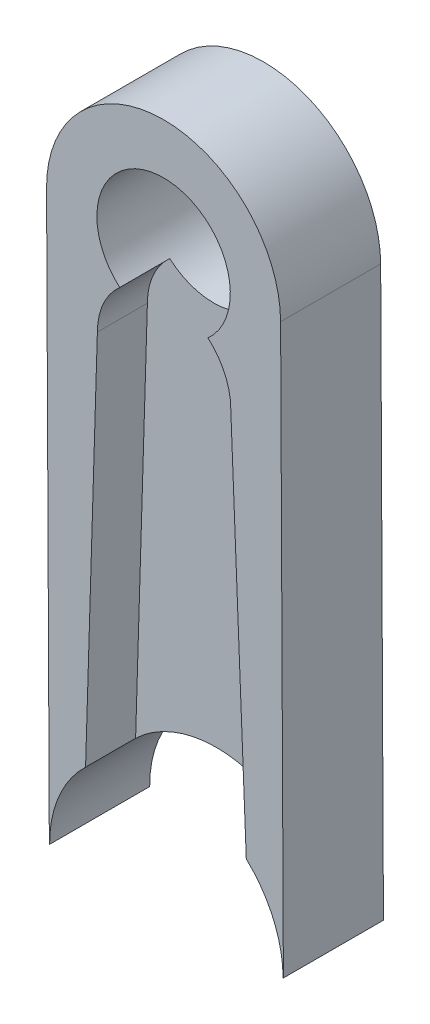
ISO-10303-21;
HEADER;
FILE_DESCRIPTION(('STEP AP214'),'2;1');
FILE_NAME('part.step','',(''),(''),'','','');
FILE_SCHEMA(('AUTOMOTIVE_DESIGN { 1 0 10303 214 1 1 1 1 }'));
ENDSEC;
DATA;
#1=APPLICATION_CONTEXT('core data for automotive mechanical design processes');
#2=APPLICATION_PROTOCOL_DEFINITION('international standard','automotive_design',2000,#1);
#3=PRODUCT_CONTEXT('',#1,'mechanical');
#4=PRODUCT('Part','Part','',(#3));
#5=PRODUCT_RELATED_PRODUCT_CATEGORY('part','',(#4));
#6=PRODUCT_DEFINITION_FORMATION('','',#4);
#7=PRODUCT_DEFINITION_CONTEXT('part definition',#1,'design');
#8=PRODUCT_DEFINITION('design','',#6,#7);
#9=PRODUCT_DEFINITION_SHAPE('','',#8);
#10=(LENGTH_UNIT() NAMED_UNIT(*) SI_UNIT(.MILLI.,.METRE.));
#11=(NAMED_UNIT(*) PLANE_ANGLE_UNIT() SI_UNIT($,.RADIAN.));
#12=(NAMED_UNIT(*) SI_UNIT($,.STERADIAN.) SOLID_ANGLE_UNIT());
#13=UNCERTAINTY_MEASURE_WITH_UNIT(LENGTH_MEASURE(1.E-05),#10,'distance_accuracy_value','');
#14=(GEOMETRIC_REPRESENTATION_CONTEXT(3) GLOBAL_UNCERTAINTY_ASSIGNED_CONTEXT((#13)) GLOBAL_UNIT_ASSIGNED_CONTEXT((#10,
#11,#12)) REPRESENTATION_CONTEXT('',''));
#15=CARTESIAN_POINT('',(0.,0.,0.));
#16=DIRECTION('',(0.,0.,1.));
#17=DIRECTION('',(1.,0.,0.));
#18=AXIS2_PLACEMENT_3D('',#15,#16,#17);
#19=CARTESIAN_POINT('',(-0.0685374686224018,14.,3.));
#20=DIRECTION('',(0.,0.,-1.));
#21=DIRECTION('',(-1.,0.,0.));
#22=AXIS2_PLACEMENT_3D('',#19,#20,#21);
#23=CYLINDRICAL_SURFACE('',#22,2.);
#24=CARTESIAN_POINT('',(-0.0685374686224018,14.,1.5));
#25=DIRECTION('',(0.,0.,1.));
#26=DIRECTION('',(1.,0.,0.));
#27=AXIS2_PLACEMENT_3D('',#24,#25,#26);
#28=CIRCLE('',#27,2.);
#29=CARTESIAN_POINT('',(-1.39872019117523,15.4935239953285,1.5));
#30=VERTEX_POINT('',#29);
#31=CARTESIAN_POINT('',(-2.0685374686224,14.,1.5));
#32=VERTEX_POINT('',#31);
#33=EDGE_CURVE('E49',#30,#32,#28,.T.);
#34=ORIENTED_EDGE('',*,*,#33,.F.);
#35=DIRECTION('',(0.,0.,-1.));
#36=VECTOR('',#35,1.);
#37=CARTESIAN_POINT('',(-1.39872019117523,15.4935239953285,3.));
#38=LINE('',#37,#36);
#39=CARTESIAN_POINT('',(-1.39872019117523,15.4935239953285,3.));
#40=VERTEX_POINT('',#39);
#41=EDGE_CURVE('E11',#40,#30,#38,.T.);
#42=ORIENTED_EDGE('',*,*,#41,.F.);
#43=CARTESIAN_POINT('',(-0.0685374686224018,14.,3.));
#44=DIRECTION('',(0.,0.,1.));
#45=DIRECTION('',(1.,0.,0.));
#46=AXIS2_PLACEMENT_3D('',#43,#44,#45);
#47=CIRCLE('',#46,2.);
#48=CARTESIAN_POINT('',(-2.0685374686224,14.,3.));
#49=VERTEX_POINT('',#48);
#50=EDGE_CURVE('E121',#40,#49,#47,.T.);
#51=ORIENTED_EDGE('',*,*,#50,.T.);
#52=DIRECTION('',(0.,0.,-1.));
#53=VECTOR('',#52,1.);
#54=CARTESIAN_POINT('',(-2.0685374686224,14.,3.));
#55=LINE('',#54,#53);
#56=EDGE_CURVE('E163',#49,#32,#55,.T.);
#57=ORIENTED_EDGE('',*,*,#56,.T.);
#58=EDGE_LOOP('',(#34,#42,#51,#57));
#59=FACE_BOUND('',#58,.T.);
#60=ADVANCED_FACE('F35',(#59),#23,.F.);
#61=CARTESIAN_POINT('',(-0.083224069041489,17.,3.));
#62=DIRECTION('',(0.,0.,-1.));
#63=DIRECTION('',(-1.,0.,0.));
#64=AXIS2_PLACEMENT_3D('',#61,#62,#63);
#65=CYLINDRICAL_SURFACE('',#64,2.);
#66=CARTESIAN_POINT('',(-0.083224069041489,17.,0.));
#67=DIRECTION('',(0.,0.,1.));
#68=DIRECTION('',(1.,0.,0.));
#69=AXIS2_PLACEMENT_3D('',#66,#67,#68);
#70=CIRCLE('',#69,2.);
#71=CARTESIAN_POINT('',(1.91677593095851,17.,0.));
#72=VERTEX_POINT('',#71);
#73=EDGE_CURVE('E164',#72,#72,#70,.T.);
#74=ORIENTED_EDGE('',*,*,#73,.F.);
#75=EDGE_LOOP('',(#74));
#76=FACE_BOUND('',#75,.T.);
#77=ORIENTED_EDGE('',*,*,#41,.T.);
#78=CARTESIAN_POINT('',(-0.083224069041489,17.,1.5));
#79=DIRECTION('',(0.,0.,1.));
#80=DIRECTION('',(1.,0.,0.));
#81=AXIS2_PLACEMENT_3D('',#78,#79,#80);
#82=CIRCLE('',#81,2.);
#83=CARTESIAN_POINT('',(1.24695865351134,15.5064760046715,1.5));
#84=VERTEX_POINT('',#83);
#85=EDGE_CURVE('E223',#30,#84,#82,.T.);
#86=ORIENTED_EDGE('',*,*,#85,.T.);
#87=DIRECTION('',(0.,0.,-1.));
#88=VECTOR('',#87,1.);
#89=CARTESIAN_POINT('',(1.24695865351134,15.5064760046715,3.));
#90=LINE('',#89,#88);
#91=CARTESIAN_POINT('',(1.24695865351134,15.5064760046715,3.));
#92=VERTEX_POINT('',#91);
#93=EDGE_CURVE('E42',#92,#84,#90,.T.);
#94=ORIENTED_EDGE('',*,*,#93,.F.);
#95=CARTESIAN_POINT('',(-0.083224069041489,17.,3.));
#96=DIRECTION('',(0.,0.,1.));
#97=DIRECTION('',(1.,0.,0.));
#98=AXIS2_PLACEMENT_3D('',#95,#96,#97);
#99=CIRCLE('',#98,2.);
#100=EDGE_CURVE('E130',#92,#40,#99,.T.);
#101=ORIENTED_EDGE('',*,*,#100,.T.);
#102=EDGE_LOOP('',(#77,#86,#94,#101));
#103=FACE_BOUND('',#102,.T.);
#104=ADVANCED_FACE('F137',(#76,#103),#65,.F.);
#105=CARTESIAN_POINT('',(-0.0685374686224018,14.,3.));
#106=DIRECTION('',(0.,0.,-1.));
#107=DIRECTION('',(-1.,0.,0.));
#108=AXIS2_PLACEMENT_3D('',#105,#106,#107);
#109=CYLINDRICAL_SURFACE('',#108,2.);
#110=CARTESIAN_POINT('',(-0.0685374686224018,14.,1.5));
#111=DIRECTION('',(0.,0.,1.));
#112=DIRECTION('',(1.,0.,0.));
#113=AXIS2_PLACEMENT_3D('',#110,#111,#112);
#114=CIRCLE('',#113,2.);
#115=CARTESIAN_POINT('',(1.9314625313776,14.,1.5));
#116=VERTEX_POINT('',#115);
#117=EDGE_CURVE('E214',#116,#84,#114,.T.);
#118=ORIENTED_EDGE('',*,*,#117,.F.);
#119=DIRECTION('',(0.,0.,-1.));
#120=VECTOR('',#119,1.);
#121=CARTESIAN_POINT('',(1.9314625313776,14.,3.));
#122=LINE('',#121,#120);
#123=CARTESIAN_POINT('',(1.9314625313776,14.,3.));
#124=VERTEX_POINT('',#123);
#125=EDGE_CURVE('E204',#124,#116,#122,.T.);
#126=ORIENTED_EDGE('',*,*,#125,.F.);
#127=CARTESIAN_POINT('',(-0.0685374686224018,14.,3.));
#128=DIRECTION('',(0.,0.,1.));
#129=DIRECTION('',(1.,0.,0.));
#130=AXIS2_PLACEMENT_3D('',#127,#128,#129);
#131=CIRCLE('',#130,2.);
#132=EDGE_CURVE('E138',#124,#92,#131,.T.);
#133=ORIENTED_EDGE('',*,*,#132,.T.);
#134=ORIENTED_EDGE('',*,*,#93,.T.);
#135=EDGE_LOOP('',(#118,#126,#133,#134));
#136=FACE_BOUND('',#135,.T.);
#137=ADVANCED_FACE('F232',(#136),#109,.F.);
#138=CARTESIAN_POINT('',(2.49588389456972,0.101357393671007,3.));
#139=DIRECTION('',(0.999176439788233,0.0405763745560247,0.));
#140=DIRECTION('',(-0.0405763745560247,0.999176439788234,0.));
#141=AXIS2_PLACEMENT_3D('',#138,#139,#140);
#142=PLANE('',#141);
#143=ORIENTED_EDGE('',*,*,#125,.T.);
#144=DIRECTION('',(0.0405763745560247,-0.999176439788234,0.));
#145=VECTOR('',#144,1.);
#146=CARTESIAN_POINT('',(2.49588389456972,0.101357393671007,1.5));
#147=LINE('',#146,#145);
#148=CARTESIAN_POINT('',(2.39640728748757,2.55092769644231,1.5));
#149=VERTEX_POINT('',#148);
#150=EDGE_CURVE('E168',#116,#149,#147,.T.);
#151=ORIENTED_EDGE('',*,*,#150,.T.);
#152=DIRECTION('',(0.,0.,-1.));
#153=VECTOR('',#152,1.);
#154=CARTESIAN_POINT('',(2.39640728748757,2.55092769644231,3.));
#155=LINE('',#154,#153);
#156=CARTESIAN_POINT('',(2.39640728748757,2.55092769644231,3.));
#157=VERTEX_POINT('',#156);
#158=EDGE_CURVE('E201',#157,#149,#155,.T.);
#159=ORIENTED_EDGE('',*,*,#158,.F.);
#160=DIRECTION('',(0.0405763745560247,-0.999176439788234,0.));
#161=VECTOR('',#160,1.);
#162=CARTESIAN_POINT('',(2.49588389456972,0.101357393671007,3.));
#163=LINE('',#162,#161);
#164=EDGE_CURVE('E140',#124,#157,#163,.T.);
#165=ORIENTED_EDGE('',*,*,#164,.F.);
#166=EDGE_LOOP('',(#143,#151,#159,#165));
#167=FACE_BOUND('',#166,.T.);
#168=ADVANCED_FACE('F209',(#167),#142,.F.);
#169=CARTESIAN_POINT('',(0.,0.,3.));
#170=DIRECTION('',(-0.00489547481029852,0.999988017091396,0.));
#171=DIRECTION('',(-0.999988017091396,-0.00489547481029852,0.));
#172=AXIS2_PLACEMENT_3D('',#169,#170,#171);
#173=PLANE('',#172);
#174=DIRECTION('',(0.999988017091396,0.00489547481029852,0.));
#175=VECTOR('',#174,1.);
#176=CARTESIAN_POINT('',(0.,0.,0.));
#177=LINE('',#176,#175);
#178=CARTESIAN_POINT('',(3.49995805981989,0.0171341618360448,0.));
#179=VERTEX_POINT('',#178);
#180=CARTESIAN_POINT('',(3.5086765760372,0.0171768436240218,0.));
#181=VERTEX_POINT('',#180);
#182=EDGE_CURVE('E167',#179,#181,#177,.T.);
#183=ORIENTED_EDGE('',*,*,#182,.T.);
#184=DIRECTION('',(0.,0.,-1.));
#185=VECTOR('',#184,1.);
#186=CARTESIAN_POINT('',(3.5086765760372,0.0171768436240218,3.));
#187=LINE('',#186,#185);
#188=CARTESIAN_POINT('',(3.5086765760372,0.0171768436240218,3.));
#189=VERTEX_POINT('',#188);
#190=EDGE_CURVE('E196',#189,#181,#187,.T.);
#191=ORIENTED_EDGE('',*,*,#190,.F.);
#192=DIRECTION('',(0.999988017091396,0.00489547481029852,0.));
#193=VECTOR('',#192,1.);
#194=CARTESIAN_POINT('',(0.,0.,3.));
#195=LINE('',#194,#193);
#196=CARTESIAN_POINT('',(3.49995805981989,0.0171341618360448,3.));
#197=VERTEX_POINT('',#196);
#198=EDGE_CURVE('E148',#197,#189,#195,.T.);
#199=ORIENTED_EDGE('',*,*,#198,.F.);
#200=DIRECTION('',(0.,0.,-1.));
#201=VECTOR('',#200,1.);
#202=CARTESIAN_POINT('',(3.49995805981989,0.0171341618360448,3.));
#203=LINE('',#202,#201);
#204=EDGE_CURVE('E198',#197,#179,#203,.T.);
#205=ORIENTED_EDGE('',*,*,#204,.T.);
#206=EDGE_LOOP('',(#183,#191,#199,#205));
#207=FACE_BOUND('',#206,.T.);
#208=ADVANCED_FACE('F239',(#207),#173,.F.);
#209=CARTESIAN_POINT('',(3.5086765760372,0.0171768436240218,3.));
#210=DIRECTION('',(0.999988017091396,0.00489547481029852,0.));
#211=DIRECTION('',(-0.00489547481029852,0.999988017091396,0.));
#212=AXIS2_PLACEMENT_3D('',#209,#210,#211);
#213=PLANE('',#212);
#214=DIRECTION('',(0.00489547481029852,-0.999988017091396,0.));
#215=VECTOR('',#214,1.);
#216=CARTESIAN_POINT('',(3.5086765760372,0.0171768436240218,0.));
#217=LINE('',#216,#215);
#218=CARTESIAN_POINT('',(3.42545250699571,17.017176843624,0.));
#219=VERTEX_POINT('',#218);
#220=EDGE_CURVE('E171',#219,#181,#217,.T.);
#221=ORIENTED_EDGE('',*,*,#220,.F.);
#222=DIRECTION('',(0.,0.,-1.));
#223=VECTOR('',#222,1.);
#224=CARTESIAN_POINT('',(3.42545250699571,17.017176843624,3.));
#225=LINE('',#224,#223);
#226=CARTESIAN_POINT('',(3.42545250699571,17.017176843624,3.));
#227=VERTEX_POINT('',#226);
#228=EDGE_CURVE('E194',#227,#219,#225,.T.);
#229=ORIENTED_EDGE('',*,*,#228,.F.);
#230=DIRECTION('',(0.00489547481029852,-0.999988017091396,0.));
#231=VECTOR('',#230,1.);
#232=CARTESIAN_POINT('',(3.5086765760372,0.0171768436240218,3.));
#233=LINE('',#232,#231);
#234=EDGE_CURVE('E150',#227,#189,#233,.T.);
#235=ORIENTED_EDGE('',*,*,#234,.T.);
#236=ORIENTED_EDGE('',*,*,#190,.T.);
#237=EDGE_LOOP('',(#221,#229,#235,#236));
#238=FACE_BOUND('',#237,.T.);
#239=ADVANCED_FACE('F330',(#238),#213,.T.);
#240=CARTESIAN_POINT('',(-0.083224069041489,17.,3.));
#241=DIRECTION('',(0.,0.,-1.));
#242=DIRECTION('',(-1.,0.,0.));
#243=AXIS2_PLACEMENT_3D('',#240,#241,#242);
#244=CYLINDRICAL_SURFACE('',#243,3.50871862069175);
#245=CARTESIAN_POINT('',(-0.083224069041489,17.,0.));
#246=DIRECTION('',(0.,0.,1.));
#247=DIRECTION('',(1.,0.,0.));
#248=AXIS2_PLACEMENT_3D('',#245,#246,#247);
#249=CIRCLE('',#248,3.50871862069175);
#250=CARTESIAN_POINT('',(-3.59190064507869,16.982823156376,0.));
#251=VERTEX_POINT('',#250);
#252=EDGE_CURVE('E174',#219,#251,#249,.T.);
#253=ORIENTED_EDGE('',*,*,#252,.T.);
#254=DIRECTION('',(0.,0.,-1.));
#255=VECTOR('',#254,1.);
#256=CARTESIAN_POINT('',(-3.59190064507869,16.982823156376,3.));
#257=LINE('',#256,#255);
#258=CARTESIAN_POINT('',(-3.59190064507869,16.982823156376,3.));
#259=VERTEX_POINT('',#258);
#260=EDGE_CURVE('E191',#259,#251,#257,.T.);
#261=ORIENTED_EDGE('',*,*,#260,.F.);
#262=CARTESIAN_POINT('',(-0.083224069041489,17.,3.));
#263=DIRECTION('',(0.,0.,1.));
#264=DIRECTION('',(1.,0.,0.));
#265=AXIS2_PLACEMENT_3D('',#262,#263,#264);
#266=CIRCLE('',#265,3.50871862069175);
#267=EDGE_CURVE('E153',#227,#259,#266,.T.);
#268=ORIENTED_EDGE('',*,*,#267,.F.);
#269=ORIENTED_EDGE('',*,*,#228,.T.);
#270=EDGE_LOOP('',(#253,#261,#268,#269));
#271=FACE_BOUND('',#270,.T.);
#272=ADVANCED_FACE('F326',(#271),#244,.T.);
#273=CARTESIAN_POINT('',(-3.5086765760372,-0.0171768436240218,3.));
#274=DIRECTION('',(0.999988017091396,0.00489547481029852,0.));
#275=DIRECTION('',(-0.00489547481029852,0.999988017091396,0.));
#276=AXIS2_PLACEMENT_3D('',#273,#274,#275);
#277=PLANE('',#276);
#278=DIRECTION('',(0.00489547481029852,-0.999988017091396,0.));
#279=VECTOR('',#278,1.);
#280=CARTESIAN_POINT('',(-3.5086765760372,-0.0171768436240218,0.));
#281=LINE('',#280,#279);
#282=CARTESIAN_POINT('',(-3.5086765760372,-0.0171768436240218,0.));
#283=VERTEX_POINT('',#282);
#284=EDGE_CURVE('E176',#251,#283,#281,.T.);
#285=ORIENTED_EDGE('',*,*,#284,.T.);
#286=DIRECTION('',(0.,0.,-1.));
#287=VECTOR('',#286,1.);
#288=CARTESIAN_POINT('',(-3.5086765760372,-0.0171768436240218,3.));
#289=LINE('',#288,#287);
#290=CARTESIAN_POINT('',(-3.5086765760372,-0.0171768436240218,3.));
#291=VERTEX_POINT('',#290);
#292=EDGE_CURVE('E188',#291,#283,#289,.T.);
#293=ORIENTED_EDGE('',*,*,#292,.F.);
#294=DIRECTION('',(0.00489547481029852,-0.999988017091396,0.));
#295=VECTOR('',#294,1.);
#296=CARTESIAN_POINT('',(-3.5086765760372,-0.0171768436240218,3.));
#297=LINE('',#296,#295);
#298=EDGE_CURVE('E155',#259,#291,#297,.T.);
#299=ORIENTED_EDGE('',*,*,#298,.F.);
#300=ORIENTED_EDGE('',*,*,#260,.T.);
#301=EDGE_LOOP('',(#285,#293,#299,#300));
#302=FACE_BOUND('',#301,.T.);
#303=ADVANCED_FACE('F322',(#302),#277,.F.);
#304=CARTESIAN_POINT('',(0.,0.,3.));
#305=DIRECTION('',(-0.00489547481029852,0.999988017091396,0.));
#306=DIRECTION('',(-0.999988017091396,-0.00489547481029852,0.));
#307=AXIS2_PLACEMENT_3D('',#304,#305,#306);
#308=PLANE('',#307);
#309=DIRECTION('',(0.999988017091396,0.00489547481029852,0.));
#310=VECTOR('',#309,1.);
#311=CARTESIAN_POINT('',(0.,0.,0.));
#312=LINE('',#311,#310);
#313=CARTESIAN_POINT('',(-3.49995805981989,-0.0171341618360448,0.));
#314=VERTEX_POINT('',#313);
#315=EDGE_CURVE('E178',#283,#314,#312,.T.);
#316=ORIENTED_EDGE('',*,*,#315,.T.);
#317=DIRECTION('',(0.,0.,-1.));
#318=VECTOR('',#317,1.);
#319=CARTESIAN_POINT('',(-3.49995805981989,-0.0171341618360448,3.));
#320=LINE('',#319,#318);
#321=CARTESIAN_POINT('',(-3.49995805981989,-0.0171341618360448,3.));
#322=VERTEX_POINT('',#321);
#323=EDGE_CURVE('E186',#322,#314,#320,.T.);
#324=ORIENTED_EDGE('',*,*,#323,.F.);
#325=DIRECTION('',(0.999988017091396,0.00489547481029852,0.));
#326=VECTOR('',#325,1.);
#327=CARTESIAN_POINT('',(0.,0.,3.));
#328=LINE('',#327,#326);
#329=EDGE_CURVE('E157',#291,#322,#328,.T.);
#330=ORIENTED_EDGE('',*,*,#329,.F.);
#331=ORIENTED_EDGE('',*,*,#292,.T.);
#332=EDGE_LOOP('',(#316,#324,#330,#331));
#333=FACE_BOUND('',#332,.T.);
#334=ADVANCED_FACE('F274',(#333),#308,.F.);
#335=CARTESIAN_POINT('',(0.,0.,3.));
#336=DIRECTION('',(0.,0.,-1.));
#337=DIRECTION('',(-1.,0.,0.));
#338=AXIS2_PLACEMENT_3D('',#335,#336,#337);
#339=CYLINDRICAL_SURFACE('',#338,3.5);
#340=CARTESIAN_POINT('',(0.,0.,0.));
#341=DIRECTION('',(0.,0.,1.));
#342=DIRECTION('',(1.,0.,0.));
#343=AXIS2_PLACEMENT_3D('',#340,#341,#342);
#344=CIRCLE('',#343,3.5);
#345=EDGE_CURVE('E135',#179,#314,#344,.T.);
#346=ORIENTED_EDGE('',*,*,#345,.F.);
#347=ORIENTED_EDGE('',*,*,#204,.F.);
#348=CARTESIAN_POINT('',(0.,0.,3.));
#349=DIRECTION('',(0.,0.,1.));
#350=DIRECTION('',(1.,0.,0.));
#351=AXIS2_PLACEMENT_3D('',#348,#349,#350);
#352=CIRCLE('',#351,3.5);
#353=EDGE_CURVE('E145',#197,#157,#352,.T.);
#354=ORIENTED_EDGE('',*,*,#353,.T.);
#355=ORIENTED_EDGE('',*,*,#158,.T.);
#356=CARTESIAN_POINT('',(0.,0.,1.5));
#357=DIRECTION('',(0.,0.,1.));
#358=DIRECTION('',(1.,0.,0.));
#359=AXIS2_PLACEMENT_3D('',#356,#357,#358);
#360=CIRCLE('',#359,3.5);
#361=CARTESIAN_POINT('',(-2.42213608999172,2.52651078793652,1.5));
#362=VERTEX_POINT('',#361);
#363=EDGE_CURVE('E217',#149,#362,#360,.T.);
#364=ORIENTED_EDGE('',*,*,#363,.T.);
#365=DIRECTION('',(0.,0.,-1.));
#366=VECTOR('',#365,1.);
#367=CARTESIAN_POINT('',(-2.42213608999172,2.52651078793652,3.));
#368=LINE('',#367,#366);
#369=CARTESIAN_POINT('',(-2.42213608999172,2.52651078793652,3.));
#370=VERTEX_POINT('',#369);
#371=EDGE_CURVE('E184',#370,#362,#368,.T.);
#372=ORIENTED_EDGE('',*,*,#371,.F.);
#373=CARTESIAN_POINT('',(0.,0.,3.));
#374=DIRECTION('',(0.,0.,1.));
#375=DIRECTION('',(1.,0.,0.));
#376=AXIS2_PLACEMENT_3D('',#373,#374,#375);
#377=CIRCLE('',#376,3.5);
#378=EDGE_CURVE('E159',#370,#322,#377,.T.);
#379=ORIENTED_EDGE('',*,*,#378,.T.);
#380=ORIENTED_EDGE('',*,*,#323,.T.);
#381=EDGE_LOOP('',(#346,#347,#354,#355,#364,#372,#379,#380));
#382=FACE_BOUND('',#381,.T.);
#383=ADVANCED_FACE('F227',(#382),#339,.F.);
#384=CARTESIAN_POINT('',(-2.49762776441439,0.0769737712623717,3.));
#385=DIRECTION('',(-0.999525440279414,0.0308041269028046,0.));
#386=DIRECTION('',(-0.0308041269028046,-0.999525440279414,0.));
#387=AXIS2_PLACEMENT_3D('',#384,#385,#386);
#388=PLANE('',#387);
#389=ORIENTED_EDGE('',*,*,#371,.T.);
#390=DIRECTION('',(0.0308041269028046,0.999525440279414,0.));
#391=VECTOR('',#390,1.);
#392=CARTESIAN_POINT('',(-2.49762776441439,0.0769737712623717,1.5));
#393=LINE('',#392,#391);
#394=EDGE_CURVE('E218',#362,#32,#393,.T.);
#395=ORIENTED_EDGE('',*,*,#394,.T.);
#396=ORIENTED_EDGE('',*,*,#56,.F.);
#397=DIRECTION('',(0.0308041269028046,0.999525440279414,0.));
#398=VECTOR('',#397,1.);
#399=CARTESIAN_POINT('',(-2.49762776441439,0.0769737712623717,3.));
#400=LINE('',#399,#398);
#401=EDGE_CURVE('E133',#370,#49,#400,.T.);
#402=ORIENTED_EDGE('',*,*,#401,.F.);
#403=EDGE_LOOP('',(#389,#395,#396,#402));
#404=FACE_BOUND('',#403,.T.);
#405=ADVANCED_FACE('F273',(#404),#388,.F.);
#406=CARTESIAN_POINT('',(0.,0.,3.));
#407=DIRECTION('',(0.,0.,1.));
#408=DIRECTION('',(1.,0.,0.));
#409=AXIS2_PLACEMENT_3D('',#406,#407,#408);
#410=PLANE('',#409);
#411=ORIENTED_EDGE('',*,*,#50,.F.);
#412=ORIENTED_EDGE('',*,*,#100,.F.);
#413=ORIENTED_EDGE('',*,*,#132,.F.);
#414=ORIENTED_EDGE('',*,*,#164,.T.);
#415=ORIENTED_EDGE('',*,*,#353,.F.);
#416=ORIENTED_EDGE('',*,*,#198,.T.);
#417=ORIENTED_EDGE('',*,*,#234,.F.);
#418=ORIENTED_EDGE('',*,*,#267,.T.);
#419=ORIENTED_EDGE('',*,*,#298,.T.);
#420=ORIENTED_EDGE('',*,*,#329,.T.);
#421=ORIENTED_EDGE('',*,*,#378,.F.);
#422=ORIENTED_EDGE('',*,*,#401,.T.);
#423=EDGE_LOOP('',(#411,#412,#413,#414,#415,#416,#417,#418,#419,#420,#421,#422));
#424=FACE_BOUND('',#423,.T.);
#425=ADVANCED_FACE('F128',(#424),#410,.T.);
#426=CARTESIAN_POINT('',(0.,0.,0.));
#427=DIRECTION('',(0.,0.,1.));
#428=DIRECTION('',(1.,0.,0.));
#429=AXIS2_PLACEMENT_3D('',#426,#427,#428);
#430=PLANE('',#429);
#431=ORIENTED_EDGE('',*,*,#73,.T.);
#432=EDGE_LOOP('',(#431));
#433=FACE_BOUND('',#432,.T.);
#434=ORIENTED_EDGE('',*,*,#182,.F.);
#435=ORIENTED_EDGE('',*,*,#345,.T.);
#436=ORIENTED_EDGE('',*,*,#315,.F.);
#437=ORIENTED_EDGE('',*,*,#284,.F.);
#438=ORIENTED_EDGE('',*,*,#252,.F.);
#439=ORIENTED_EDGE('',*,*,#220,.T.);
#440=EDGE_LOOP('',(#434,#435,#436,#437,#438,#439));
#441=FACE_BOUND('',#440,.T.);
#442=ADVANCED_FACE('F292',(#433,#441),#430,.F.);
#443=CARTESIAN_POINT('',(0.,0.,1.5));
#444=DIRECTION('',(0.,0.,1.));
#445=DIRECTION('',(1.,0.,0.));
#446=AXIS2_PLACEMENT_3D('',#443,#444,#445);
#447=PLANE('',#446);
#448=ORIENTED_EDGE('',*,*,#117,.T.);
#449=ORIENTED_EDGE('',*,*,#85,.F.);
#450=ORIENTED_EDGE('',*,*,#33,.T.);
#451=ORIENTED_EDGE('',*,*,#394,.F.);
#452=ORIENTED_EDGE('',*,*,#363,.F.);
#453=ORIENTED_EDGE('',*,*,#150,.F.);
#454=EDGE_LOOP('',(#448,#449,#450,#451,#452,#453));
#455=FACE_BOUND('',#454,.T.);
#456=ADVANCED_FACE('F213',(#455),#447,.T.);
#457=CLOSED_SHELL('',(#60,#104,#137,#168,#208,#239,#272,#303,#334,#383,#405,#425,#442,#456));
#458=MANIFOLD_SOLID_BREP('B2',#457);
#459=ADVANCED_BREP_SHAPE_REPRESENTATION('',(#18,#458),#14);
#460=SHAPE_DEFINITION_REPRESENTATION(#9,#459);
ENDSEC;
END-ISO-10303-21;
